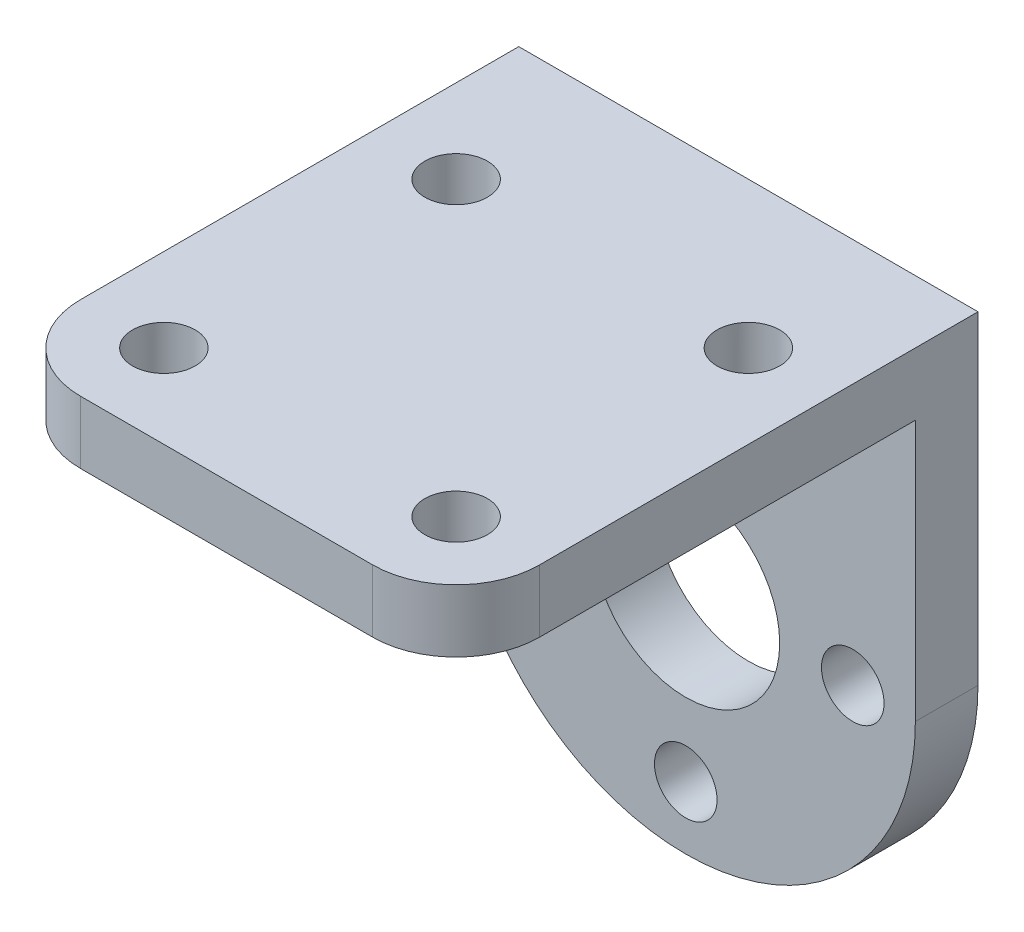
ISO-10303-21;
HEADER;
FILE_DESCRIPTION(('STEP AP214'),'2;1');
FILE_NAME('part.step','',(''),(''),'','','');
FILE_SCHEMA(('AUTOMOTIVE_DESIGN { 1 0 10303 214 1 1 1 1 }'));
ENDSEC;
DATA;
#1=APPLICATION_CONTEXT('core data for automotive mechanical design processes');
#2=APPLICATION_PROTOCOL_DEFINITION('international standard','automotive_design',2000,#1);
#3=PRODUCT_CONTEXT('',#1,'mechanical');
#4=PRODUCT('Part','Part','',(#3));
#5=PRODUCT_RELATED_PRODUCT_CATEGORY('part','',(#4));
#6=PRODUCT_DEFINITION_FORMATION('','',#4);
#7=PRODUCT_DEFINITION_CONTEXT('part definition',#1,'design');
#8=PRODUCT_DEFINITION('design','',#6,#7);
#9=PRODUCT_DEFINITION_SHAPE('','',#8);
#10=(LENGTH_UNIT() NAMED_UNIT(*) SI_UNIT(.MILLI.,.METRE.));
#11=(NAMED_UNIT(*) PLANE_ANGLE_UNIT() SI_UNIT($,.RADIAN.));
#12=(NAMED_UNIT(*) SI_UNIT($,.STERADIAN.) SOLID_ANGLE_UNIT());
#13=UNCERTAINTY_MEASURE_WITH_UNIT(LENGTH_MEASURE(1.E-05),#10,'distance_accuracy_value','');
#14=(GEOMETRIC_REPRESENTATION_CONTEXT(3) GLOBAL_UNCERTAINTY_ASSIGNED_CONTEXT((#13)) GLOBAL_UNIT_ASSIGNED_CONTEXT((#10,
#11,#12)) REPRESENTATION_CONTEXT('',''));
#15=CARTESIAN_POINT('',(0.,0.,0.));
#16=DIRECTION('',(0.,0.,1.));
#17=DIRECTION('',(1.,0.,0.));
#18=AXIS2_PLACEMENT_3D('',#15,#16,#17);
#19=CARTESIAN_POINT('',(0.,0.,3.));
#20=DIRECTION('',(0.,0.,1.));
#21=DIRECTION('',(1.,0.,0.));
#22=AXIS2_PLACEMENT_3D('',#19,#20,#21);
#23=PLANE('',#22);
#24=DIRECTION('',(1.,0.,0.));
#25=VECTOR('',#24,1.);
#26=CARTESIAN_POINT('',(10.9999999999993,12.499999999999,3.));
#27=LINE('',#26,#25);
#28=CARTESIAN_POINT('',(-10.9999999999993,12.499999999999,3.));
#29=VERTEX_POINT('',#28);
#30=CARTESIAN_POINT('',(10.9999999999993,12.499999999999,3.));
#31=VERTEX_POINT('',#30);
#32=EDGE_CURVE('E109',#29,#31,#27,.T.);
#33=ORIENTED_EDGE('',*,*,#32,.F.);
#34=DIRECTION('',(0.,-1.,0.));
#35=VECTOR('',#34,1.);
#36=CARTESIAN_POINT('',(-10.9999999999993,0.,3.));
#37=LINE('',#36,#35);
#38=CARTESIAN_POINT('',(-10.9999999999993,0.,3.));
#39=VERTEX_POINT('',#38);
#40=EDGE_CURVE('E114',#29,#39,#37,.T.);
#41=ORIENTED_EDGE('',*,*,#40,.T.);
#42=CARTESIAN_POINT('',(0.,0.,3.));
#43=DIRECTION('',(0.,0.,1.));
#44=DIRECTION('',(1.,0.,0.));
#45=AXIS2_PLACEMENT_3D('',#42,#43,#44);
#46=CIRCLE('',#45,10.9999999999993);
#47=CARTESIAN_POINT('',(10.9999999999993,0.,3.));
#48=VERTEX_POINT('',#47);
#49=EDGE_CURVE('E112',#39,#48,#46,.T.);
#50=ORIENTED_EDGE('',*,*,#49,.T.);
#51=DIRECTION('',(0.,1.,0.));
#52=VECTOR('',#51,1.);
#53=CARTESIAN_POINT('',(10.9999999999993,0.,3.));
#54=LINE('',#53,#52);
#55=EDGE_CURVE('E99',#48,#31,#54,.T.);
#56=ORIENTED_EDGE('',*,*,#55,.T.);
#57=EDGE_LOOP('',(#33,#41,#50,#56));
#58=FACE_BOUND('',#57,.T.);
#59=CARTESIAN_POINT('',(0.,7.99999999999904,3.));
#60=DIRECTION('',(0.,0.,1.));
#61=DIRECTION('',(1.,0.,0.));
#62=AXIS2_PLACEMENT_3D('',#59,#60,#61);
#63=CIRCLE('',#62,1.5);
#64=CARTESIAN_POINT('',(1.49999999999998,7.99999999999904,3.));
#65=VERTEX_POINT('',#64);
#66=EDGE_CURVE('E141',#65,#65,#63,.T.);
#67=ORIENTED_EDGE('',*,*,#66,.F.);
#68=EDGE_LOOP('',(#67));
#69=FACE_BOUND('',#68,.T.);
#70=CARTESIAN_POINT('',(8.,-1.35158675701116E-12,3.));
#71=DIRECTION('',(0.,0.,1.));
#72=DIRECTION('',(1.,0.,0.));
#73=AXIS2_PLACEMENT_3D('',#70,#71,#72);
#74=CIRCLE('',#73,1.49999999999997);
#75=CARTESIAN_POINT('',(9.49999999999997,-1.35158675701116E-12,3.));
#76=VERTEX_POINT('',#75);
#77=EDGE_CURVE('E153',#76,#76,#74,.T.);
#78=ORIENTED_EDGE('',*,*,#77,.F.);
#79=EDGE_LOOP('',(#78));
#80=FACE_BOUND('',#79,.T.);
#81=CARTESIAN_POINT('',(0.,0.,3.));
#82=DIRECTION('',(0.,0.,1.));
#83=DIRECTION('',(1.,0.,0.));
#84=AXIS2_PLACEMENT_3D('',#81,#82,#83);
#85=CIRCLE('',#84,4.5);
#86=CARTESIAN_POINT('',(4.5,0.,3.));
#87=VERTEX_POINT('',#86);
#88=EDGE_CURVE('E159',#87,#87,#85,.T.);
#89=ORIENTED_EDGE('',*,*,#88,.F.);
#90=EDGE_LOOP('',(#89));
#91=FACE_BOUND('',#90,.T.);
#92=CARTESIAN_POINT('',(0.,-8.00000000000085,3.));
#93=DIRECTION('',(0.,0.,1.));
#94=DIRECTION('',(1.,0.,0.));
#95=AXIS2_PLACEMENT_3D('',#92,#93,#94);
#96=CIRCLE('',#95,1.49999999999997);
#97=CARTESIAN_POINT('',(1.49999999999995,-8.00000000000085,3.));
#98=VERTEX_POINT('',#97);
#99=EDGE_CURVE('E147',#98,#98,#96,.T.);
#100=ORIENTED_EDGE('',*,*,#99,.F.);
#101=EDGE_LOOP('',(#100));
#102=FACE_BOUND('',#101,.T.);
#103=CARTESIAN_POINT('',(-8.,-1.35179682118208E-12,3.));
#104=DIRECTION('',(0.,0.,1.));
#105=DIRECTION('',(1.,0.,0.));
#106=AXIS2_PLACEMENT_3D('',#103,#104,#105);
#107=CIRCLE('',#106,1.49999999999997);
#108=CARTESIAN_POINT('',(-6.50000000000003,-1.35179682118208E-12,3.));
#109=VERTEX_POINT('',#108);
#110=EDGE_CURVE('E134',#109,#109,#107,.T.);
#111=ORIENTED_EDGE('',*,*,#110,.F.);
#112=EDGE_LOOP('',(#111));
#113=FACE_BOUND('',#112,.T.);
#114=ADVANCED_FACE('F33',(#58,#69,#80,#91,#102,#113),#23,.T.);
#115=CARTESIAN_POINT('',(0.,0.,0.));
#116=DIRECTION('',(0.,0.,1.));
#117=DIRECTION('',(1.,0.,0.));
#118=AXIS2_PLACEMENT_3D('',#115,#116,#117);
#119=PLANE('',#118);
#120=CARTESIAN_POINT('',(0.,7.99999999999904,0.));
#121=DIRECTION('',(0.,0.,1.));
#122=DIRECTION('',(1.,0.,0.));
#123=AXIS2_PLACEMENT_3D('',#120,#121,#122);
#124=CIRCLE('',#123,1.5);
#125=CARTESIAN_POINT('',(1.49999999999998,7.99999999999904,0.));
#126=VERTEX_POINT('',#125);
#127=EDGE_CURVE('E137',#126,#126,#124,.T.);
#128=ORIENTED_EDGE('',*,*,#127,.T.);
#129=EDGE_LOOP('',(#128));
#130=FACE_BOUND('',#129,.T.);
#131=CARTESIAN_POINT('',(8.,-1.35158675701116E-12,0.));
#132=DIRECTION('',(0.,0.,1.));
#133=DIRECTION('',(1.,0.,0.));
#134=AXIS2_PLACEMENT_3D('',#131,#132,#133);
#135=CIRCLE('',#134,1.49999999999997);
#136=CARTESIAN_POINT('',(9.49999999999997,-1.35158675701116E-12,0.));
#137=VERTEX_POINT('',#136);
#138=EDGE_CURVE('E150',#137,#137,#135,.T.);
#139=ORIENTED_EDGE('',*,*,#138,.T.);
#140=EDGE_LOOP('',(#139));
#141=FACE_BOUND('',#140,.T.);
#142=CARTESIAN_POINT('',(0.,0.,0.));
#143=DIRECTION('',(0.,0.,1.));
#144=DIRECTION('',(1.,0.,0.));
#145=AXIS2_PLACEMENT_3D('',#142,#143,#144);
#146=CIRCLE('',#145,10.9999999999993);
#147=CARTESIAN_POINT('',(-10.9999999999993,0.,0.));
#148=VERTEX_POINT('',#147);
#149=CARTESIAN_POINT('',(10.9999999999993,0.,0.));
#150=VERTEX_POINT('',#149);
#151=EDGE_CURVE('E162',#148,#150,#146,.T.);
#152=ORIENTED_EDGE('',*,*,#151,.F.);
#153=DIRECTION('',(0.,-1.,0.));
#154=VECTOR('',#153,1.);
#155=CARTESIAN_POINT('',(-10.9999999999993,0.,0.));
#156=LINE('',#155,#154);
#157=CARTESIAN_POINT('',(-10.9999999999993,15.499999999999,0.));
#158=VERTEX_POINT('',#157);
#159=EDGE_CURVE('E166',#158,#148,#156,.T.);
#160=ORIENTED_EDGE('',*,*,#159,.F.);
#161=DIRECTION('',(-1.,0.,0.));
#162=VECTOR('',#161,1.);
#163=CARTESIAN_POINT('',(10.9999999999993,15.499999999999,0.));
#164=LINE('',#163,#162);
#165=CARTESIAN_POINT('',(10.9999999999993,15.499999999999,0.));
#166=VERTEX_POINT('',#165);
#167=EDGE_CURVE('E182',#166,#158,#164,.T.);
#168=ORIENTED_EDGE('',*,*,#167,.F.);
#169=DIRECTION('',(0.,1.,0.));
#170=VECTOR('',#169,1.);
#171=CARTESIAN_POINT('',(10.9999999999993,0.,0.));
#172=LINE('',#171,#170);
#173=EDGE_CURVE('E185',#150,#166,#172,.T.);
#174=ORIENTED_EDGE('',*,*,#173,.F.);
#175=EDGE_LOOP('',(#152,#160,#168,#174));
#176=FACE_BOUND('',#175,.T.);
#177=CARTESIAN_POINT('',(0.,0.,0.));
#178=DIRECTION('',(0.,0.,1.));
#179=DIRECTION('',(1.,0.,0.));
#180=AXIS2_PLACEMENT_3D('',#177,#178,#179);
#181=CIRCLE('',#180,4.5);
#182=CARTESIAN_POINT('',(4.5,0.,0.));
#183=VERTEX_POINT('',#182);
#184=EDGE_CURVE('E156',#183,#183,#181,.T.);
#185=ORIENTED_EDGE('',*,*,#184,.T.);
#186=EDGE_LOOP('',(#185));
#187=FACE_BOUND('',#186,.T.);
#188=CARTESIAN_POINT('',(0.,-8.00000000000085,0.));
#189=DIRECTION('',(0.,0.,1.));
#190=DIRECTION('',(1.,0.,0.));
#191=AXIS2_PLACEMENT_3D('',#188,#189,#190);
#192=CIRCLE('',#191,1.49999999999997);
#193=CARTESIAN_POINT('',(1.49999999999995,-8.00000000000085,0.));
#194=VERTEX_POINT('',#193);
#195=EDGE_CURVE('E144',#194,#194,#192,.T.);
#196=ORIENTED_EDGE('',*,*,#195,.T.);
#197=EDGE_LOOP('',(#196));
#198=FACE_BOUND('',#197,.T.);
#199=CARTESIAN_POINT('',(-8.,-1.35179682118208E-12,0.));
#200=DIRECTION('',(0.,0.,1.));
#201=DIRECTION('',(1.,0.,0.));
#202=AXIS2_PLACEMENT_3D('',#199,#200,#201);
#203=CIRCLE('',#202,1.49999999999997);
#204=CARTESIAN_POINT('',(-6.50000000000003,-1.35179682118208E-12,0.));
#205=VERTEX_POINT('',#204);
#206=EDGE_CURVE('E138',#205,#205,#203,.T.);
#207=ORIENTED_EDGE('',*,*,#206,.T.);
#208=EDGE_LOOP('',(#207));
#209=FACE_BOUND('',#208,.T.);
#210=ADVANCED_FACE('F194',(#130,#141,#176,#187,#198,#209),#119,.F.);
#211=CARTESIAN_POINT('',(0.,0.,3.));
#212=DIRECTION('',(0.,0.,-1.));
#213=DIRECTION('',(-1.,0.,0.));
#214=AXIS2_PLACEMENT_3D('',#211,#212,#213);
#215=CYLINDRICAL_SURFACE('',#214,10.9999999999993);
#216=ORIENTED_EDGE('',*,*,#151,.T.);
#217=DIRECTION('',(0.,0.,-1.));
#218=VECTOR('',#217,1.);
#219=CARTESIAN_POINT('',(10.9999999999993,0.,3.));
#220=LINE('',#219,#218);
#221=EDGE_CURVE('E171',#48,#150,#220,.T.);
#222=ORIENTED_EDGE('',*,*,#221,.F.);
#223=ORIENTED_EDGE('',*,*,#49,.F.);
#224=DIRECTION('',(0.,0.,-1.));
#225=VECTOR('',#224,1.);
#226=CARTESIAN_POINT('',(-10.9999999999993,0.,3.));
#227=LINE('',#226,#225);
#228=EDGE_CURVE('E178',#39,#148,#227,.T.);
#229=ORIENTED_EDGE('',*,*,#228,.T.);
#230=EDGE_LOOP('',(#216,#222,#223,#229));
#231=FACE_BOUND('',#230,.T.);
#232=ADVANCED_FACE('F190',(#231),#215,.T.);
#233=CARTESIAN_POINT('',(10.9999999999993,0.,3.));
#234=DIRECTION('',(-1.,0.,0.));
#235=DIRECTION('',(0.,0.,1.));
#236=AXIS2_PLACEMENT_3D('',#233,#234,#235);
#237=PLANE('',#236);
#238=DIRECTION('',(0.,0.,-1.));
#239=VECTOR('',#238,1.);
#240=CARTESIAN_POINT('',(10.9999999999993,15.499999999999,3.));
#241=LINE('',#240,#239);
#242=CARTESIAN_POINT('',(10.9999999999993,15.499999999999,21.));
#243=VERTEX_POINT('',#242);
#244=EDGE_CURVE('E174',#243,#166,#241,.T.);
#245=ORIENTED_EDGE('',*,*,#244,.F.);
#246=DIRECTION('',(0.,1.,0.));
#247=VECTOR('',#246,1.);
#248=CARTESIAN_POINT('',(10.9999999999993,0.,21.));
#249=LINE('',#248,#247);
#250=CARTESIAN_POINT('',(10.9999999999993,12.499999999999,21.));
#251=VERTEX_POINT('',#250);
#252=EDGE_CURVE('E56',#243,#251,#249,.F.);
#253=ORIENTED_EDGE('',*,*,#252,.T.);
#254=DIRECTION('',(0.,0.,-1.));
#255=VECTOR('',#254,1.);
#256=CARTESIAN_POINT('',(10.9999999999993,12.499999999999,25.));
#257=LINE('',#256,#255);
#258=EDGE_CURVE('E95',#251,#31,#257,.T.);
#259=ORIENTED_EDGE('',*,*,#258,.T.);
#260=ORIENTED_EDGE('',*,*,#55,.F.);
#261=ORIENTED_EDGE('',*,*,#221,.T.);
#262=ORIENTED_EDGE('',*,*,#173,.T.);
#263=EDGE_LOOP('',(#245,#253,#259,#260,#261,#262));
#264=FACE_BOUND('',#263,.T.);
#265=ADVANCED_FACE('F97',(#264),#237,.F.);
#266=CARTESIAN_POINT('',(10.9999999999993,15.499999999999,3.));
#267=DIRECTION('',(0.,-1.,0.));
#268=DIRECTION('',(1.,0.,0.));
#269=AXIS2_PLACEMENT_3D('',#266,#267,#268);
#270=PLANE('',#269);
#271=CARTESIAN_POINT('',(-6.99999999999929,15.499999999999,7.));
#272=DIRECTION('',(0.,-1.,0.));
#273=DIRECTION('',(1.,0.,0.));
#274=AXIS2_PLACEMENT_3D('',#271,#272,#273);
#275=CIRCLE('',#274,1.5);
#276=CARTESIAN_POINT('',(-5.49999999999929,15.499999999999,7.));
#277=VERTEX_POINT('',#276);
#278=EDGE_CURVE('E290',#277,#277,#275,.F.);
#279=ORIENTED_EDGE('',*,*,#278,.F.);
#280=EDGE_LOOP('',(#279));
#281=FACE_BOUND('',#280,.T.);
#282=CARTESIAN_POINT('',(6.99999999999929,15.499999999999,7.));
#283=DIRECTION('',(0.,-1.,0.));
#284=DIRECTION('',(1.,0.,0.));
#285=AXIS2_PLACEMENT_3D('',#282,#283,#284);
#286=CIRCLE('',#285,1.5);
#287=CARTESIAN_POINT('',(8.49999999999929,15.499999999999,7.));
#288=VERTEX_POINT('',#287);
#289=EDGE_CURVE('E294',#288,#288,#286,.F.);
#290=ORIENTED_EDGE('',*,*,#289,.F.);
#291=EDGE_LOOP('',(#290));
#292=FACE_BOUND('',#291,.T.);
#293=CARTESIAN_POINT('',(-6.99999999999929,15.499999999999,21.));
#294=DIRECTION('',(0.,-1.,0.));
#295=DIRECTION('',(1.,0.,0.));
#296=AXIS2_PLACEMENT_3D('',#293,#294,#295);
#297=CIRCLE('',#296,1.5);
#298=CARTESIAN_POINT('',(-5.49999999999929,15.499999999999,21.));
#299=VERTEX_POINT('',#298);
#300=EDGE_CURVE('E303',#299,#299,#297,.F.);
#301=ORIENTED_EDGE('',*,*,#300,.F.);
#302=EDGE_LOOP('',(#301));
#303=FACE_BOUND('',#302,.T.);
#304=CARTESIAN_POINT('',(6.99999999999929,15.499999999999,21.));
#305=DIRECTION('',(0.,-1.,0.));
#306=DIRECTION('',(1.,0.,0.));
#307=AXIS2_PLACEMENT_3D('',#304,#305,#306);
#308=CIRCLE('',#307,1.5);
#309=CARTESIAN_POINT('',(8.49999999999929,15.499999999999,21.));
#310=VERTEX_POINT('',#309);
#311=EDGE_CURVE('E118',#310,#310,#308,.F.);
#312=ORIENTED_EDGE('',*,*,#311,.F.);
#313=EDGE_LOOP('',(#312));
#314=FACE_BOUND('',#313,.T.);
#315=DIRECTION('',(-1.,0.,0.));
#316=VECTOR('',#315,1.);
#317=CARTESIAN_POINT('',(10.9999999999993,15.499999999999,25.));
#318=LINE('',#317,#316);
#319=CARTESIAN_POINT('',(6.99999999999929,15.499999999999,25.));
#320=VERTEX_POINT('',#319);
#321=CARTESIAN_POINT('',(-6.99999999999929,15.499999999999,25.));
#322=VERTEX_POINT('',#321);
#323=EDGE_CURVE('E117',#320,#322,#318,.T.);
#324=ORIENTED_EDGE('',*,*,#323,.F.);
#325=CARTESIAN_POINT('',(6.99999999999929,15.499999999999,21.));
#326=DIRECTION('',(0.,-1.,0.));
#327=DIRECTION('',(1.,0.,0.));
#328=AXIS2_PLACEMENT_3D('',#325,#326,#327);
#329=CIRCLE('',#328,4.);
#330=EDGE_CURVE('E201',#320,#243,#329,.F.);
#331=ORIENTED_EDGE('',*,*,#330,.T.);
#332=ORIENTED_EDGE('',*,*,#244,.T.);
#333=ORIENTED_EDGE('',*,*,#167,.T.);
#334=DIRECTION('',(0.,0.,-1.));
#335=VECTOR('',#334,1.);
#336=CARTESIAN_POINT('',(-10.9999999999993,15.499999999999,3.));
#337=LINE('',#336,#335);
#338=CARTESIAN_POINT('',(-10.9999999999993,15.499999999999,21.));
#339=VERTEX_POINT('',#338);
#340=EDGE_CURVE('E176',#339,#158,#337,.T.);
#341=ORIENTED_EDGE('',*,*,#340,.F.);
#342=CARTESIAN_POINT('',(-6.99999999999929,15.499999999999,21.));
#343=DIRECTION('',(0.,-1.,0.));
#344=DIRECTION('',(1.,0.,0.));
#345=AXIS2_PLACEMENT_3D('',#342,#343,#344);
#346=CIRCLE('',#345,4.);
#347=EDGE_CURVE('E205',#339,#322,#346,.F.);
#348=ORIENTED_EDGE('',*,*,#347,.T.);
#349=EDGE_LOOP('',(#324,#331,#332,#333,#341,#348));
#350=FACE_BOUND('',#349,.T.);
#351=ADVANCED_FACE('F217',(#281,#292,#303,#314,#350),#270,.F.);
#352=CARTESIAN_POINT('',(-10.9999999999993,0.,3.));
#353=DIRECTION('',(1.,0.,0.));
#354=DIRECTION('',(0.,0.,-1.));
#355=AXIS2_PLACEMENT_3D('',#352,#353,#354);
#356=PLANE('',#355);
#357=DIRECTION('',(0.,0.,-1.));
#358=VECTOR('',#357,1.);
#359=CARTESIAN_POINT('',(-10.9999999999993,12.499999999999,25.));
#360=LINE('',#359,#358);
#361=CARTESIAN_POINT('',(-10.9999999999993,12.499999999999,21.));
#362=VERTEX_POINT('',#361);
#363=EDGE_CURVE('E103',#362,#29,#360,.T.);
#364=ORIENTED_EDGE('',*,*,#363,.F.);
#365=DIRECTION('',(0.,-1.,0.));
#366=VECTOR('',#365,1.);
#367=CARTESIAN_POINT('',(-10.9999999999993,0.,21.));
#368=LINE('',#367,#366);
#369=EDGE_CURVE('E11',#362,#339,#368,.F.);
#370=ORIENTED_EDGE('',*,*,#369,.T.);
#371=ORIENTED_EDGE('',*,*,#340,.T.);
#372=ORIENTED_EDGE('',*,*,#159,.T.);
#373=ORIENTED_EDGE('',*,*,#228,.F.);
#374=ORIENTED_EDGE('',*,*,#40,.F.);
#375=EDGE_LOOP('',(#364,#370,#371,#372,#373,#374));
#376=FACE_BOUND('',#375,.T.);
#377=ADVANCED_FACE('F225',(#376),#356,.F.);
#378=CARTESIAN_POINT('',(0.,0.,3.));
#379=DIRECTION('',(0.,0.,-1.));
#380=DIRECTION('',(-1.,0.,0.));
#381=AXIS2_PLACEMENT_3D('',#378,#379,#380);
#382=CYLINDRICAL_SURFACE('',#381,4.5);
#383=ORIENTED_EDGE('',*,*,#88,.T.);
#384=EDGE_LOOP('',(#383));
#385=FACE_BOUND('',#384,.T.);
#386=ORIENTED_EDGE('',*,*,#184,.F.);
#387=EDGE_LOOP('',(#386));
#388=FACE_BOUND('',#387,.T.);
#389=ADVANCED_FACE('F227',(#385,#388),#382,.F.);
#390=CARTESIAN_POINT('',(8.,-1.35158675701116E-12,3.));
#391=DIRECTION('',(0.,0.,-1.));
#392=DIRECTION('',(-1.,0.,0.));
#393=AXIS2_PLACEMENT_3D('',#390,#391,#392);
#394=CYLINDRICAL_SURFACE('',#393,1.49999999999997);
#395=ORIENTED_EDGE('',*,*,#77,.T.);
#396=EDGE_LOOP('',(#395));
#397=FACE_BOUND('',#396,.T.);
#398=ORIENTED_EDGE('',*,*,#138,.F.);
#399=EDGE_LOOP('',(#398));
#400=FACE_BOUND('',#399,.T.);
#401=ADVANCED_FACE('F233',(#397,#400),#394,.F.);
#402=CARTESIAN_POINT('',(0.,-8.00000000000085,3.));
#403=DIRECTION('',(0.,0.,-1.));
#404=DIRECTION('',(-1.,0.,0.));
#405=AXIS2_PLACEMENT_3D('',#402,#403,#404);
#406=CYLINDRICAL_SURFACE('',#405,1.49999999999997);
#407=ORIENTED_EDGE('',*,*,#99,.T.);
#408=EDGE_LOOP('',(#407));
#409=FACE_BOUND('',#408,.T.);
#410=ORIENTED_EDGE('',*,*,#195,.F.);
#411=EDGE_LOOP('',(#410));
#412=FACE_BOUND('',#411,.T.);
#413=ADVANCED_FACE('F248',(#409,#412),#406,.F.);
#414=CARTESIAN_POINT('',(0.,7.99999999999904,3.));
#415=DIRECTION('',(0.,0.,-1.));
#416=DIRECTION('',(-1.,0.,0.));
#417=AXIS2_PLACEMENT_3D('',#414,#415,#416);
#418=CYLINDRICAL_SURFACE('',#417,1.5);
#419=ORIENTED_EDGE('',*,*,#66,.T.);
#420=EDGE_LOOP('',(#419));
#421=FACE_BOUND('',#420,.T.);
#422=ORIENTED_EDGE('',*,*,#127,.F.);
#423=EDGE_LOOP('',(#422));
#424=FACE_BOUND('',#423,.T.);
#425=ADVANCED_FACE('F252',(#421,#424),#418,.F.);
#426=CARTESIAN_POINT('',(-8.,-1.35179682118208E-12,3.));
#427=DIRECTION('',(0.,0.,-1.));
#428=DIRECTION('',(-1.,0.,0.));
#429=AXIS2_PLACEMENT_3D('',#426,#427,#428);
#430=CYLINDRICAL_SURFACE('',#429,1.49999999999997);
#431=ORIENTED_EDGE('',*,*,#110,.T.);
#432=EDGE_LOOP('',(#431));
#433=FACE_BOUND('',#432,.T.);
#434=ORIENTED_EDGE('',*,*,#206,.F.);
#435=EDGE_LOOP('',(#434));
#436=FACE_BOUND('',#435,.T.);
#437=ADVANCED_FACE('F256',(#433,#436),#430,.F.);
#438=CARTESIAN_POINT('',(10.9999999999993,12.499999999999,25.));
#439=DIRECTION('',(0.,1.,0.));
#440=DIRECTION('',(-1.,0.,0.));
#441=AXIS2_PLACEMENT_3D('',#438,#439,#440);
#442=PLANE('',#441);
#443=CARTESIAN_POINT('',(-6.99999999999929,12.499999999999,7.));
#444=DIRECTION('',(0.,-1.,0.));
#445=DIRECTION('',(1.,0.,0.));
#446=AXIS2_PLACEMENT_3D('',#443,#444,#445);
#447=CIRCLE('',#446,1.5);
#448=CARTESIAN_POINT('',(-5.49999999999929,12.499999999999,7.));
#449=VERTEX_POINT('',#448);
#450=EDGE_CURVE('E287',#449,#449,#447,.T.);
#451=ORIENTED_EDGE('',*,*,#450,.F.);
#452=EDGE_LOOP('',(#451));
#453=FACE_BOUND('',#452,.T.);
#454=CARTESIAN_POINT('',(6.99999999999929,12.499999999999,7.));
#455=DIRECTION('',(0.,-1.,0.));
#456=DIRECTION('',(-1.,0.,0.));
#457=AXIS2_PLACEMENT_3D('',#454,#455,#456);
#458=CIRCLE('',#457,1.5);
#459=CARTESIAN_POINT('',(5.49999999999929,12.499999999999,7.));
#460=VERTEX_POINT('',#459);
#461=EDGE_CURVE('E291',#460,#460,#458,.T.);
#462=ORIENTED_EDGE('',*,*,#461,.F.);
#463=EDGE_LOOP('',(#462));
#464=FACE_BOUND('',#463,.T.);
#465=CARTESIAN_POINT('',(-6.99999999999929,12.499999999999,21.));
#466=DIRECTION('',(0.,-1.,0.));
#467=DIRECTION('',(-1.,0.,0.));
#468=AXIS2_PLACEMENT_3D('',#465,#466,#467);
#469=CIRCLE('',#468,1.5);
#470=CARTESIAN_POINT('',(-8.49999999999929,12.499999999999,21.));
#471=VERTEX_POINT('',#470);
#472=EDGE_CURVE('E300',#471,#471,#469,.T.);
#473=ORIENTED_EDGE('',*,*,#472,.F.);
#474=EDGE_LOOP('',(#473));
#475=FACE_BOUND('',#474,.T.);
#476=CARTESIAN_POINT('',(6.99999999999929,12.499999999999,21.));
#477=DIRECTION('',(0.,-1.,0.));
#478=DIRECTION('',(1.,0.,0.));
#479=AXIS2_PLACEMENT_3D('',#476,#477,#478);
#480=CIRCLE('',#479,1.5);
#481=CARTESIAN_POINT('',(8.49999999999929,12.499999999999,21.));
#482=VERTEX_POINT('',#481);
#483=EDGE_CURVE('E123',#482,#482,#480,.T.);
#484=ORIENTED_EDGE('',*,*,#483,.F.);
#485=EDGE_LOOP('',(#484));
#486=FACE_BOUND('',#485,.T.);
#487=ORIENTED_EDGE('',*,*,#258,.F.);
#488=CARTESIAN_POINT('',(6.99999999999929,12.499999999999,21.));
#489=DIRECTION('',(0.,1.,0.));
#490=DIRECTION('',(-1.,0.,0.));
#491=AXIS2_PLACEMENT_3D('',#488,#489,#490);
#492=CIRCLE('',#491,4.);
#493=CARTESIAN_POINT('',(6.99999999999929,12.499999999999,25.));
#494=VERTEX_POINT('',#493);
#495=EDGE_CURVE('E41',#251,#494,#492,.F.);
#496=ORIENTED_EDGE('',*,*,#495,.T.);
#497=DIRECTION('',(1.,0.,0.));
#498=VECTOR('',#497,1.);
#499=CARTESIAN_POINT('',(10.9999999999993,12.499999999999,25.));
#500=LINE('',#499,#498);
#501=CARTESIAN_POINT('',(-6.99999999999929,12.499999999999,25.));
#502=VERTEX_POINT('',#501);
#503=EDGE_CURVE('E104',#502,#494,#500,.T.);
#504=ORIENTED_EDGE('',*,*,#503,.F.);
#505=CARTESIAN_POINT('',(-6.99999999999929,12.499999999999,21.));
#506=DIRECTION('',(0.,1.,0.));
#507=DIRECTION('',(-1.,0.,0.));
#508=AXIS2_PLACEMENT_3D('',#505,#506,#507);
#509=CIRCLE('',#508,4.);
#510=EDGE_CURVE('E48',#502,#362,#509,.F.);
#511=ORIENTED_EDGE('',*,*,#510,.T.);
#512=ORIENTED_EDGE('',*,*,#363,.T.);
#513=ORIENTED_EDGE('',*,*,#32,.T.);
#514=EDGE_LOOP('',(#487,#496,#504,#511,#512,#513));
#515=FACE_BOUND('',#514,.T.);
#516=ADVANCED_FACE('F116',(#453,#464,#475,#486,#515),#442,.F.);
#517=CARTESIAN_POINT('',(0.,0.,25.));
#518=DIRECTION('',(0.,0.,-1.));
#519=DIRECTION('',(-1.,0.,0.));
#520=AXIS2_PLACEMENT_3D('',#517,#518,#519);
#521=PLANE('',#520);
#522=ORIENTED_EDGE('',*,*,#503,.T.);
#523=DIRECTION('',(0.,1.,0.));
#524=VECTOR('',#523,1.);
#525=CARTESIAN_POINT('',(6.99999999999929,0.,25.));
#526=LINE('',#525,#524);
#527=EDGE_CURVE('E212',#494,#320,#526,.T.);
#528=ORIENTED_EDGE('',*,*,#527,.T.);
#529=ORIENTED_EDGE('',*,*,#323,.T.);
#530=DIRECTION('',(0.,-1.,0.));
#531=VECTOR('',#530,1.);
#532=CARTESIAN_POINT('',(-6.99999999999929,0.,25.));
#533=LINE('',#532,#531);
#534=EDGE_CURVE('E173',#322,#502,#533,.T.);
#535=ORIENTED_EDGE('',*,*,#534,.T.);
#536=EDGE_LOOP('',(#522,#528,#529,#535));
#537=FACE_BOUND('',#536,.T.);
#538=ADVANCED_FACE('F223',(#537),#521,.F.);
#539=CARTESIAN_POINT('',(6.99999999999929,15.500999999999,21.));
#540=DIRECTION('',(0.,-1.,0.));
#541=DIRECTION('',(1.,0.,0.));
#542=AXIS2_PLACEMENT_3D('',#539,#540,#541);
#543=CYLINDRICAL_SURFACE('',#542,1.5);
#544=ORIENTED_EDGE('',*,*,#483,.T.);
#545=EDGE_LOOP('',(#544));
#546=FACE_BOUND('',#545,.T.);
#547=ORIENTED_EDGE('',*,*,#311,.T.);
#548=EDGE_LOOP('',(#547));
#549=FACE_BOUND('',#548,.T.);
#550=ADVANCED_FACE('F266',(#546,#549),#543,.F.);
#551=CARTESIAN_POINT('',(-6.99999999999929,15.500999999999,21.));
#552=DIRECTION('',(0.,-1.,0.));
#553=DIRECTION('',(1.,0.,0.));
#554=AXIS2_PLACEMENT_3D('',#551,#552,#553);
#555=CYLINDRICAL_SURFACE('',#554,1.5);
#556=ORIENTED_EDGE('',*,*,#472,.T.);
#557=EDGE_LOOP('',(#556));
#558=FACE_BOUND('',#557,.T.);
#559=ORIENTED_EDGE('',*,*,#300,.T.);
#560=EDGE_LOOP('',(#559));
#561=FACE_BOUND('',#560,.T.);
#562=ADVANCED_FACE('F269',(#558,#561),#555,.F.);
#563=CARTESIAN_POINT('',(6.99999999999929,15.500999999999,7.));
#564=DIRECTION('',(0.,-1.,0.));
#565=DIRECTION('',(1.,0.,0.));
#566=AXIS2_PLACEMENT_3D('',#563,#564,#565);
#567=CYLINDRICAL_SURFACE('',#566,1.5);
#568=ORIENTED_EDGE('',*,*,#461,.T.);
#569=EDGE_LOOP('',(#568));
#570=FACE_BOUND('',#569,.T.);
#571=ORIENTED_EDGE('',*,*,#289,.T.);
#572=EDGE_LOOP('',(#571));
#573=FACE_BOUND('',#572,.T.);
#574=ADVANCED_FACE('F273',(#570,#573),#567,.F.);
#575=CARTESIAN_POINT('',(-6.99999999999929,15.500999999999,7.));
#576=DIRECTION('',(0.,-1.,0.));
#577=DIRECTION('',(1.,0.,0.));
#578=AXIS2_PLACEMENT_3D('',#575,#576,#577);
#579=CYLINDRICAL_SURFACE('',#578,1.5);
#580=ORIENTED_EDGE('',*,*,#450,.T.);
#581=EDGE_LOOP('',(#580));
#582=FACE_BOUND('',#581,.T.);
#583=ORIENTED_EDGE('',*,*,#278,.T.);
#584=EDGE_LOOP('',(#583));
#585=FACE_BOUND('',#584,.T.);
#586=ADVANCED_FACE('F277',(#582,#585),#579,.F.);
#587=CARTESIAN_POINT('',(6.99999999999929,0.,21.));
#588=DIRECTION('',(0.,1.,0.));
#589=DIRECTION('',(0.,0.,1.));
#590=AXIS2_PLACEMENT_3D('',#587,#588,#589);
#591=CYLINDRICAL_SURFACE('',#590,4.);
#592=ORIENTED_EDGE('',*,*,#495,.F.);
#593=ORIENTED_EDGE('',*,*,#252,.F.);
#594=ORIENTED_EDGE('',*,*,#330,.F.);
#595=ORIENTED_EDGE('',*,*,#527,.F.);
#596=EDGE_LOOP('',(#592,#593,#594,#595));
#597=FACE_BOUND('',#596,.T.);
#598=ADVANCED_FACE('F199',(#597),#591,.T.);
#599=CARTESIAN_POINT('',(-6.99999999999929,0.,21.));
#600=DIRECTION('',(0.,-1.,0.));
#601=DIRECTION('',(0.,0.,-1.));
#602=AXIS2_PLACEMENT_3D('',#599,#600,#601);
#603=CYLINDRICAL_SURFACE('',#602,4.);
#604=ORIENTED_EDGE('',*,*,#347,.F.);
#605=ORIENTED_EDGE('',*,*,#369,.F.);
#606=ORIENTED_EDGE('',*,*,#510,.F.);
#607=ORIENTED_EDGE('',*,*,#534,.F.);
#608=EDGE_LOOP('',(#604,#605,#606,#607));
#609=FACE_BOUND('',#608,.T.);
#610=ADVANCED_FACE('F35',(#609),#603,.T.);
#611=CLOSED_SHELL('',(#114,#210,#232,#265,#351,#377,#389,#401,#413,#425,#437,#516,#538,#550,
#562,#574,#586,#598,#610));
#612=MANIFOLD_SOLID_BREP('B2',#611);
#613=ADVANCED_BREP_SHAPE_REPRESENTATION('',(#18,#612),#14);
#614=SHAPE_DEFINITION_REPRESENTATION(#9,#613);
ENDSEC;
END-ISO-10303-21;
